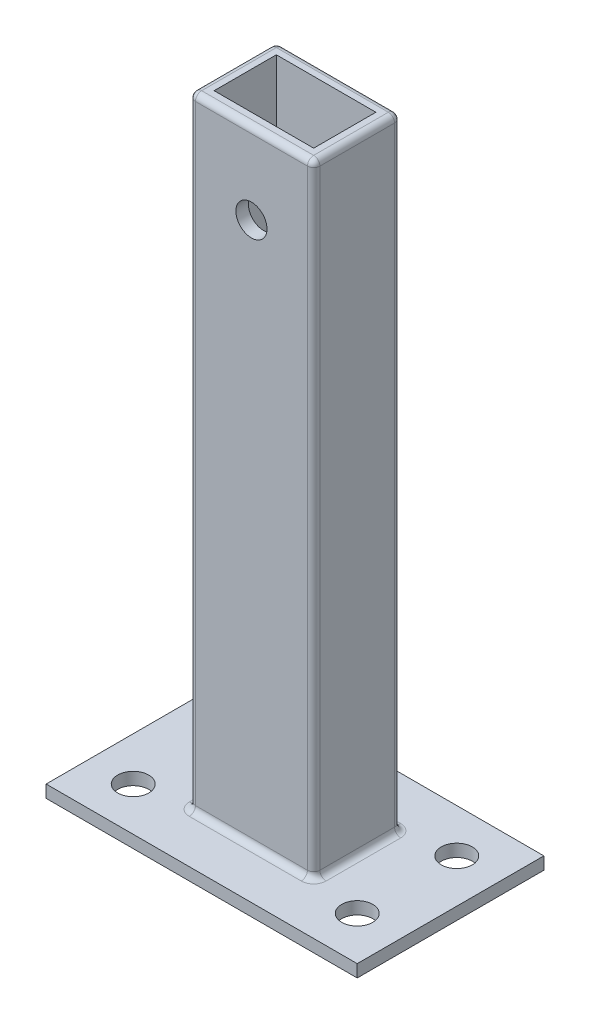
ISO-10303-21;
HEADER;
FILE_DESCRIPTION(('STEP AP214'),'2;1');
FILE_NAME('part.step','',(''),(''),'','','');
FILE_SCHEMA(('AUTOMOTIVE_DESIGN { 1 0 10303 214 1 1 1 1 }'));
ENDSEC;
DATA;
#1=APPLICATION_CONTEXT('core data for automotive mechanical design processes');
#2=APPLICATION_PROTOCOL_DEFINITION('international standard','automotive_design',2000,#1);
#3=PRODUCT_CONTEXT('',#1,'mechanical');
#4=PRODUCT('Part','Part','',(#3));
#5=PRODUCT_RELATED_PRODUCT_CATEGORY('part','',(#4));
#6=PRODUCT_DEFINITION_FORMATION('','',#4);
#7=PRODUCT_DEFINITION_CONTEXT('part definition',#1,'design');
#8=PRODUCT_DEFINITION('design','',#6,#7);
#9=PRODUCT_DEFINITION_SHAPE('','',#8);
#10=(LENGTH_UNIT() NAMED_UNIT(*) SI_UNIT(.MILLI.,.METRE.));
#11=(NAMED_UNIT(*) PLANE_ANGLE_UNIT() SI_UNIT($,.RADIAN.));
#12=(NAMED_UNIT(*) SI_UNIT($,.STERADIAN.) SOLID_ANGLE_UNIT());
#13=UNCERTAINTY_MEASURE_WITH_UNIT(LENGTH_MEASURE(1.E-05),#10,'distance_accuracy_value','');
#14=(GEOMETRIC_REPRESENTATION_CONTEXT(3) GLOBAL_UNCERTAINTY_ASSIGNED_CONTEXT((#13)) GLOBAL_UNIT_ASSIGNED_CONTEXT((#10,
#11,#12)) REPRESENTATION_CONTEXT('',''));
#15=CARTESIAN_POINT('',(0.,0.,0.));
#16=DIRECTION('',(0.,0.,1.));
#17=DIRECTION('',(1.,0.,0.));
#18=AXIS2_PLACEMENT_3D('',#15,#16,#17);
#19=CARTESIAN_POINT('',(0.,0.,0.));
#20=DIRECTION('',(0.,-1.,0.));
#21=DIRECTION('',(0.,0.,-1.));
#22=AXIS2_PLACEMENT_3D('',#19,#20,#21);
#23=PLANE('',#22);
#24=DIRECTION('',(0.,0.,1.));
#25=VECTOR('',#24,1.);
#26=CARTESIAN_POINT('',(25.,0.,15.));
#27=LINE('',#26,#25);
#28=CARTESIAN_POINT('',(25.,0.,-15.));
#29=VERTEX_POINT('',#28);
#30=CARTESIAN_POINT('',(25.,0.,15.));
#31=VERTEX_POINT('',#30);
#32=EDGE_CURVE('E220',#29,#31,#27,.T.);
#33=ORIENTED_EDGE('',*,*,#32,.F.);
#34=DIRECTION('',(1.,0.,0.));
#35=VECTOR('',#34,1.);
#36=CARTESIAN_POINT('',(-25.,0.,-15.));
#37=LINE('',#36,#35);
#38=CARTESIAN_POINT('',(-25.,0.,-15.));
#39=VERTEX_POINT('',#38);
#40=EDGE_CURVE('E216',#39,#29,#37,.T.);
#41=ORIENTED_EDGE('',*,*,#40,.F.);
#42=DIRECTION('',(0.,0.,-1.));
#43=VECTOR('',#42,1.);
#44=CARTESIAN_POINT('',(-25.,0.,15.));
#45=LINE('',#44,#43);
#46=CARTESIAN_POINT('',(-25.,0.,15.));
#47=VERTEX_POINT('',#46);
#48=EDGE_CURVE('E510',#47,#39,#45,.T.);
#49=ORIENTED_EDGE('',*,*,#48,.F.);
#50=DIRECTION('',(-1.,0.,0.));
#51=VECTOR('',#50,1.);
#52=CARTESIAN_POINT('',(-25.,0.,15.));
#53=LINE('',#52,#51);
#54=EDGE_CURVE('E507',#31,#47,#53,.T.);
#55=ORIENTED_EDGE('',*,*,#54,.F.);
#56=EDGE_LOOP('',(#33,#41,#49,#55));
#57=FACE_BOUND('',#56,.T.);
#58=CARTESIAN_POINT('',(18.,0.,8.00000000000001));
#59=DIRECTION('',(0.,1.,0.));
#60=DIRECTION('',(0.,0.,1.));
#61=AXIS2_PLACEMENT_3D('',#58,#59,#60);
#62=CIRCLE('',#61,2.5);
#63=CARTESIAN_POINT('',(18.,0.,10.5));
#64=VERTEX_POINT('',#63);
#65=EDGE_CURVE('E481',#64,#64,#62,.T.);
#66=ORIENTED_EDGE('',*,*,#65,.F.);
#67=EDGE_LOOP('',(#66));
#68=FACE_BOUND('',#67,.T.);
#69=CARTESIAN_POINT('',(-18.,0.,-8.00000000000001));
#70=DIRECTION('',(0.,1.,0.));
#71=DIRECTION('',(0.,0.,1.));
#72=AXIS2_PLACEMENT_3D('',#69,#70,#71);
#73=CIRCLE('',#72,2.5);
#74=CARTESIAN_POINT('',(-18.,0.,-5.50000000000001));
#75=VERTEX_POINT('',#74);
#76=EDGE_CURVE('E468',#75,#75,#73,.T.);
#77=ORIENTED_EDGE('',*,*,#76,.F.);
#78=EDGE_LOOP('',(#77));
#79=FACE_BOUND('',#78,.T.);
#80=CARTESIAN_POINT('',(-18.,0.,8.00000000000001));
#81=DIRECTION('',(0.,1.,0.));
#82=DIRECTION('',(0.,0.,-1.));
#83=AXIS2_PLACEMENT_3D('',#80,#81,#82);
#84=CIRCLE('',#83,2.5);
#85=CARTESIAN_POINT('',(-18.,0.,5.50000000000001));
#86=VERTEX_POINT('',#85);
#87=EDGE_CURVE('E473',#86,#86,#84,.T.);
#88=ORIENTED_EDGE('',*,*,#87,.F.);
#89=EDGE_LOOP('',(#88));
#90=FACE_BOUND('',#89,.T.);
#91=CARTESIAN_POINT('',(18.,0.,-8.00000000000001));
#92=DIRECTION('',(0.,1.,0.));
#93=DIRECTION('',(0.,0.,-1.));
#94=AXIS2_PLACEMENT_3D('',#91,#92,#93);
#95=CIRCLE('',#94,2.5);
#96=CARTESIAN_POINT('',(18.,0.,-10.5));
#97=VERTEX_POINT('',#96);
#98=EDGE_CURVE('E482',#97,#97,#95,.T.);
#99=ORIENTED_EDGE('',*,*,#98,.F.);
#100=EDGE_LOOP('',(#99));
#101=FACE_BOUND('',#100,.T.);
#102=CARTESIAN_POINT('',(9.,0.,6.));
#103=DIRECTION('',(0.,-1.,0.));
#104=DIRECTION('',(0.,0.,-1.));
#105=AXIS2_PLACEMENT_3D('',#102,#103,#104);
#106=CIRCLE('',#105,2.);
#107=CARTESIAN_POINT('',(9.,0.,8.));
#108=VERTEX_POINT('',#107);
#109=CARTESIAN_POINT('',(11.,0.,6.));
#110=VERTEX_POINT('',#109);
#111=EDGE_CURVE('E314',#108,#110,#106,.F.);
#112=ORIENTED_EDGE('',*,*,#111,.F.);
#113=DIRECTION('',(1.,0.,0.));
#114=VECTOR('',#113,1.);
#115=CARTESIAN_POINT('',(-10.,0.,8.));
#116=LINE('',#115,#114);
#117=CARTESIAN_POINT('',(-9.,0.,8.));
#118=VERTEX_POINT('',#117);
#119=EDGE_CURVE('E310',#108,#118,#116,.F.);
#120=ORIENTED_EDGE('',*,*,#119,.T.);
#121=CARTESIAN_POINT('',(-9.,0.,6.));
#122=DIRECTION('',(0.,-1.,0.));
#123=DIRECTION('',(0.,0.,-1.));
#124=AXIS2_PLACEMENT_3D('',#121,#122,#123);
#125=CIRCLE('',#124,2.);
#126=CARTESIAN_POINT('',(-11.,0.,6.));
#127=VERTEX_POINT('',#126);
#128=EDGE_CURVE('E306',#127,#118,#125,.F.);
#129=ORIENTED_EDGE('',*,*,#128,.F.);
#130=DIRECTION('',(0.,0.,1.));
#131=VECTOR('',#130,1.);
#132=CARTESIAN_POINT('',(-11.,0.,-7.));
#133=LINE('',#132,#131);
#134=CARTESIAN_POINT('',(-11.,0.,-6.));
#135=VERTEX_POINT('',#134);
#136=EDGE_CURVE('E300',#127,#135,#133,.F.);
#137=ORIENTED_EDGE('',*,*,#136,.T.);
#138=CARTESIAN_POINT('',(-9.,0.,-6.));
#139=DIRECTION('',(0.,-1.,0.));
#140=DIRECTION('',(0.,0.,-1.));
#141=AXIS2_PLACEMENT_3D('',#138,#139,#140);
#142=CIRCLE('',#141,2.);
#143=CARTESIAN_POINT('',(-9.,0.,-8.));
#144=VERTEX_POINT('',#143);
#145=EDGE_CURVE('E296',#144,#135,#142,.F.);
#146=ORIENTED_EDGE('',*,*,#145,.F.);
#147=DIRECTION('',(-1.,0.,0.));
#148=VECTOR('',#147,1.);
#149=CARTESIAN_POINT('',(10.,0.,-8.));
#150=LINE('',#149,#148);
#151=CARTESIAN_POINT('',(9.,0.,-8.));
#152=VERTEX_POINT('',#151);
#153=EDGE_CURVE('E293',#144,#152,#150,.F.);
#154=ORIENTED_EDGE('',*,*,#153,.T.);
#155=CARTESIAN_POINT('',(9.,0.,-6.));
#156=DIRECTION('',(0.,-1.,0.));
#157=DIRECTION('',(0.,0.,-1.));
#158=AXIS2_PLACEMENT_3D('',#155,#156,#157);
#159=CIRCLE('',#158,2.);
#160=CARTESIAN_POINT('',(11.,0.,-6.));
#161=VERTEX_POINT('',#160);
#162=EDGE_CURVE('E289',#161,#152,#159,.F.);
#163=ORIENTED_EDGE('',*,*,#162,.F.);
#164=DIRECTION('',(0.,0.,-1.));
#165=VECTOR('',#164,1.);
#166=CARTESIAN_POINT('',(11.,0.,7.));
#167=LINE('',#166,#165);
#168=EDGE_CURVE('E303',#161,#110,#167,.F.);
#169=ORIENTED_EDGE('',*,*,#168,.T.);
#170=EDGE_LOOP('',(#112,#120,#129,#137,#146,#154,#163,#169));
#171=FACE_BOUND('',#170,.T.);
#172=ADVANCED_FACE('F41',(#57,#68,#79,#90,#101,#171),#23,.F.);
#173=CARTESIAN_POINT('',(0.,100.,0.));
#174=DIRECTION('',(0.,1.,0.));
#175=DIRECTION('',(0.,0.,1.));
#176=AXIS2_PLACEMENT_3D('',#173,#174,#175);
#177=PLANE('',#176);
#178=DIRECTION('',(1.,0.,0.));
#179=VECTOR('',#178,1.);
#180=CARTESIAN_POINT('',(10.,100.,6.));
#181=LINE('',#180,#179);
#182=CARTESIAN_POINT('',(-9.,100.,6.));
#183=VERTEX_POINT('',#182);
#184=CARTESIAN_POINT('',(9.,100.,6.));
#185=VERTEX_POINT('',#184);
#186=EDGE_CURVE('E357',#183,#185,#181,.T.);
#187=ORIENTED_EDGE('',*,*,#186,.T.);
#188=DIRECTION('',(0.,0.,-1.));
#189=VECTOR('',#188,1.);
#190=CARTESIAN_POINT('',(9.,100.,-7.));
#191=LINE('',#190,#189);
#192=CARTESIAN_POINT('',(9.,100.,-6.));
#193=VERTEX_POINT('',#192);
#194=EDGE_CURVE('E11',#185,#193,#191,.T.);
#195=ORIENTED_EDGE('',*,*,#194,.T.);
#196=DIRECTION('',(-1.,0.,0.));
#197=VECTOR('',#196,1.);
#198=CARTESIAN_POINT('',(-10.,100.,-6.));
#199=LINE('',#198,#197);
#200=CARTESIAN_POINT('',(-9.,100.,-6.));
#201=VERTEX_POINT('',#200);
#202=EDGE_CURVE('E51',#193,#201,#199,.T.);
#203=ORIENTED_EDGE('',*,*,#202,.T.);
#204=DIRECTION('',(0.,0.,1.));
#205=VECTOR('',#204,1.);
#206=CARTESIAN_POINT('',(-9.,100.,7.));
#207=LINE('',#206,#205);
#208=EDGE_CURVE('E360',#201,#183,#207,.T.);
#209=ORIENTED_EDGE('',*,*,#208,.T.);
#210=EDGE_LOOP('',(#187,#195,#203,#209));
#211=FACE_BOUND('',#210,.T.);
#212=DIRECTION('',(-1.,0.,0.));
#213=VECTOR('',#212,1.);
#214=CARTESIAN_POINT('',(-8.,100.,-5.));
#215=LINE('',#214,#213);
#216=CARTESIAN_POINT('',(8.,100.,-5.));
#217=VERTEX_POINT('',#216);
#218=CARTESIAN_POINT('',(-8.,100.,-5.));
#219=VERTEX_POINT('',#218);
#220=EDGE_CURVE('E236',#217,#219,#215,.T.);
#221=ORIENTED_EDGE('',*,*,#220,.F.);
#222=DIRECTION('',(0.,0.,-1.));
#223=VECTOR('',#222,1.);
#224=CARTESIAN_POINT('',(8.,100.,-5.));
#225=LINE('',#224,#223);
#226=CARTESIAN_POINT('',(8.,100.,5.));
#227=VERTEX_POINT('',#226);
#228=EDGE_CURVE('E233',#227,#217,#225,.T.);
#229=ORIENTED_EDGE('',*,*,#228,.F.);
#230=DIRECTION('',(1.,0.,0.));
#231=VECTOR('',#230,1.);
#232=CARTESIAN_POINT('',(-8.,100.,5.));
#233=LINE('',#232,#231);
#234=CARTESIAN_POINT('',(-8.,100.,5.));
#235=VERTEX_POINT('',#234);
#236=EDGE_CURVE('E244',#235,#227,#233,.T.);
#237=ORIENTED_EDGE('',*,*,#236,.F.);
#238=DIRECTION('',(0.,0.,1.));
#239=VECTOR('',#238,1.);
#240=CARTESIAN_POINT('',(-8.,100.,-5.));
#241=LINE('',#240,#239);
#242=EDGE_CURVE('E240',#219,#235,#241,.T.);
#243=ORIENTED_EDGE('',*,*,#242,.F.);
#244=EDGE_LOOP('',(#221,#229,#237,#243));
#245=FACE_BOUND('',#244,.T.);
#246=ADVANCED_FACE('F536',(#211,#245),#177,.T.);
#247=CARTESIAN_POINT('',(10.,100.,-7.));
#248=DIRECTION('',(-1.,0.,0.));
#249=DIRECTION('',(0.,0.,1.));
#250=AXIS2_PLACEMENT_3D('',#247,#248,#249);
#251=PLANE('',#250);
#252=DIRECTION('',(0.,-1.,0.));
#253=VECTOR('',#252,1.);
#254=CARTESIAN_POINT('',(10.,100.,6.));
#255=LINE('',#254,#253);
#256=CARTESIAN_POINT('',(10.,99.,6.));
#257=VERTEX_POINT('',#256);
#258=CARTESIAN_POINT('',(10.,1.,6.));
#259=VERTEX_POINT('',#258);
#260=EDGE_CURVE('E321',#257,#259,#255,.T.);
#261=ORIENTED_EDGE('',*,*,#260,.T.);
#262=DIRECTION('',(0.,0.,-1.));
#263=VECTOR('',#262,1.);
#264=CARTESIAN_POINT('',(10.,1.,-7.));
#265=LINE('',#264,#263);
#266=CARTESIAN_POINT('',(10.,1.,-6.));
#267=VERTEX_POINT('',#266);
#268=EDGE_CURVE('E327',#259,#267,#265,.T.);
#269=ORIENTED_EDGE('',*,*,#268,.T.);
#270=DIRECTION('',(0.,-1.,0.));
#271=VECTOR('',#270,1.);
#272=CARTESIAN_POINT('',(10.,100.,-6.));
#273=LINE('',#272,#271);
#274=CARTESIAN_POINT('',(10.,99.,-6.));
#275=VERTEX_POINT('',#274);
#276=EDGE_CURVE('E324',#267,#275,#273,.F.);
#277=ORIENTED_EDGE('',*,*,#276,.T.);
#278=DIRECTION('',(0.,0.,-1.));
#279=VECTOR('',#278,1.);
#280=CARTESIAN_POINT('',(10.,99.,7.));
#281=LINE('',#280,#279);
#282=EDGE_CURVE('E318',#275,#257,#281,.F.);
#283=ORIENTED_EDGE('',*,*,#282,.T.);
#284=EDGE_LOOP('',(#261,#269,#277,#283));
#285=FACE_BOUND('',#284,.T.);
#286=ADVANCED_FACE('F542',(#285),#251,.F.);
#287=CARTESIAN_POINT('',(-10.,100.,-7.));
#288=DIRECTION('',(0.,0.,1.));
#289=DIRECTION('',(1.,0.,0.));
#290=AXIS2_PLACEMENT_3D('',#287,#288,#289);
#291=PLANE('',#290);
#292=DIRECTION('',(0.,-1.,0.));
#293=VECTOR('',#292,1.);
#294=CARTESIAN_POINT('',(9.,100.,-7.));
#295=LINE('',#294,#293);
#296=CARTESIAN_POINT('',(9.,99.,-7.));
#297=VERTEX_POINT('',#296);
#298=CARTESIAN_POINT('',(9.,1.,-7.));
#299=VERTEX_POINT('',#298);
#300=EDGE_CURVE('E350',#297,#299,#295,.T.);
#301=ORIENTED_EDGE('',*,*,#300,.T.);
#302=DIRECTION('',(-1.,0.,0.));
#303=VECTOR('',#302,1.);
#304=CARTESIAN_POINT('',(-10.,1.,-7.));
#305=LINE('',#304,#303);
#306=CARTESIAN_POINT('',(-9.,1.,-7.));
#307=VERTEX_POINT('',#306);
#308=EDGE_CURVE('E353',#299,#307,#305,.T.);
#309=ORIENTED_EDGE('',*,*,#308,.T.);
#310=DIRECTION('',(0.,-1.,0.));
#311=VECTOR('',#310,1.);
#312=CARTESIAN_POINT('',(-9.,100.,-7.));
#313=LINE('',#312,#311);
#314=CARTESIAN_POINT('',(-9.,99.,-7.));
#315=VERTEX_POINT('',#314);
#316=EDGE_CURVE('E347',#307,#315,#313,.F.);
#317=ORIENTED_EDGE('',*,*,#316,.T.);
#318=DIRECTION('',(-1.,0.,0.));
#319=VECTOR('',#318,1.);
#320=CARTESIAN_POINT('',(10.,99.,-7.));
#321=LINE('',#320,#319);
#322=EDGE_CURVE('E344',#315,#297,#321,.F.);
#323=ORIENTED_EDGE('',*,*,#322,.T.);
#324=EDGE_LOOP('',(#301,#309,#317,#323));
#325=FACE_BOUND('',#324,.T.);
#326=CARTESIAN_POINT('',(0.,87.,-7.));
#327=DIRECTION('',(0.,0.,1.));
#328=DIRECTION('',(1.,0.,0.));
#329=AXIS2_PLACEMENT_3D('',#326,#327,#328);
#330=CIRCLE('',#329,2.5);
#331=CARTESIAN_POINT('',(2.5,87.,-7.));
#332=VERTEX_POINT('',#331);
#333=EDGE_CURVE('E464',#332,#332,#330,.T.);
#334=ORIENTED_EDGE('',*,*,#333,.T.);
#335=EDGE_LOOP('',(#334));
#336=FACE_BOUND('',#335,.T.);
#337=ADVANCED_FACE('F590',(#325,#336),#291,.F.);
#338=CARTESIAN_POINT('',(-10.,100.,-7.));
#339=DIRECTION('',(1.,0.,0.));
#340=DIRECTION('',(0.,0.,-1.));
#341=AXIS2_PLACEMENT_3D('',#338,#339,#340);
#342=PLANE('',#341);
#343=DIRECTION('',(0.,-1.,0.));
#344=VECTOR('',#343,1.);
#345=CARTESIAN_POINT('',(-10.,100.,-6.));
#346=LINE('',#345,#344);
#347=CARTESIAN_POINT('',(-10.,99.,-6.));
#348=VERTEX_POINT('',#347);
#349=CARTESIAN_POINT('',(-10.,1.,-6.));
#350=VERTEX_POINT('',#349);
#351=EDGE_CURVE('E337',#348,#350,#346,.T.);
#352=ORIENTED_EDGE('',*,*,#351,.T.);
#353=DIRECTION('',(0.,0.,1.));
#354=VECTOR('',#353,1.);
#355=CARTESIAN_POINT('',(-10.,1.,7.));
#356=LINE('',#355,#354);
#357=CARTESIAN_POINT('',(-10.,1.,6.));
#358=VERTEX_POINT('',#357);
#359=EDGE_CURVE('E340',#350,#358,#356,.T.);
#360=ORIENTED_EDGE('',*,*,#359,.T.);
#361=DIRECTION('',(0.,-1.,0.));
#362=VECTOR('',#361,1.);
#363=CARTESIAN_POINT('',(-10.,100.,6.));
#364=LINE('',#363,#362);
#365=CARTESIAN_POINT('',(-10.,99.,6.));
#366=VERTEX_POINT('',#365);
#367=EDGE_CURVE('E331',#358,#366,#364,.F.);
#368=ORIENTED_EDGE('',*,*,#367,.T.);
#369=DIRECTION('',(0.,0.,1.));
#370=VECTOR('',#369,1.);
#371=CARTESIAN_POINT('',(-10.,99.,-7.));
#372=LINE('',#371,#370);
#373=EDGE_CURVE('E334',#366,#348,#372,.F.);
#374=ORIENTED_EDGE('',*,*,#373,.T.);
#375=EDGE_LOOP('',(#352,#360,#368,#374));
#376=FACE_BOUND('',#375,.T.);
#377=ADVANCED_FACE('F586',(#376),#342,.F.);
#378=CARTESIAN_POINT('',(-10.,100.,7.));
#379=DIRECTION('',(0.,0.,-1.));
#380=DIRECTION('',(-1.,0.,0.));
#381=AXIS2_PLACEMENT_3D('',#378,#379,#380);
#382=PLANE('',#381);
#383=DIRECTION('',(0.,-1.,0.));
#384=VECTOR('',#383,1.);
#385=CARTESIAN_POINT('',(-9.,100.,7.));
#386=LINE('',#385,#384);
#387=CARTESIAN_POINT('',(-9.,99.,7.));
#388=VERTEX_POINT('',#387);
#389=CARTESIAN_POINT('',(-9.,1.,7.));
#390=VERTEX_POINT('',#389);
#391=EDGE_CURVE('E279',#388,#390,#386,.T.);
#392=ORIENTED_EDGE('',*,*,#391,.T.);
#393=DIRECTION('',(1.,0.,0.));
#394=VECTOR('',#393,1.);
#395=CARTESIAN_POINT('',(10.,1.,7.));
#396=LINE('',#395,#394);
#397=CARTESIAN_POINT('',(9.,1.,7.));
#398=VERTEX_POINT('',#397);
#399=EDGE_CURVE('E285',#390,#398,#396,.T.);
#400=ORIENTED_EDGE('',*,*,#399,.T.);
#401=DIRECTION('',(0.,-1.,0.));
#402=VECTOR('',#401,1.);
#403=CARTESIAN_POINT('',(9.,100.,7.));
#404=LINE('',#403,#402);
#405=CARTESIAN_POINT('',(9.,99.,7.));
#406=VERTEX_POINT('',#405);
#407=EDGE_CURVE('E282',#398,#406,#404,.F.);
#408=ORIENTED_EDGE('',*,*,#407,.T.);
#409=DIRECTION('',(1.,0.,0.));
#410=VECTOR('',#409,1.);
#411=CARTESIAN_POINT('',(-10.,99.,7.));
#412=LINE('',#411,#410);
#413=EDGE_CURVE('E270',#406,#388,#412,.F.);
#414=ORIENTED_EDGE('',*,*,#413,.T.);
#415=EDGE_LOOP('',(#392,#400,#408,#414));
#416=FACE_BOUND('',#415,.T.);
#417=CARTESIAN_POINT('',(0.,87.,7.));
#418=DIRECTION('',(0.,0.,1.));
#419=DIRECTION('',(1.,0.,0.));
#420=AXIS2_PLACEMENT_3D('',#417,#418,#419);
#421=CIRCLE('',#420,2.5);
#422=CARTESIAN_POINT('',(2.5,87.,7.));
#423=VERTEX_POINT('',#422);
#424=EDGE_CURVE('E276',#423,#423,#421,.T.);
#425=ORIENTED_EDGE('',*,*,#424,.F.);
#426=EDGE_LOOP('',(#425));
#427=FACE_BOUND('',#426,.T.);
#428=ADVANCED_FACE('F582',(#416,#427),#382,.F.);
#429=CARTESIAN_POINT('',(8.,100.,-5.));
#430=DIRECTION('',(-1.,0.,0.));
#431=DIRECTION('',(0.,0.,1.));
#432=AXIS2_PLACEMENT_3D('',#429,#430,#431);
#433=PLANE('',#432);
#434=DIRECTION('',(0.,0.,-1.));
#435=VECTOR('',#434,1.);
#436=CARTESIAN_POINT('',(8.,0.,-5.));
#437=LINE('',#436,#435);
#438=CARTESIAN_POINT('',(8.,0.,5.));
#439=VERTEX_POINT('',#438);
#440=CARTESIAN_POINT('',(8.,0.,-5.));
#441=VERTEX_POINT('',#440);
#442=EDGE_CURVE('E222',#439,#441,#437,.T.);
#443=ORIENTED_EDGE('',*,*,#442,.F.);
#444=DIRECTION('',(0.,-1.,0.));
#445=VECTOR('',#444,1.);
#446=CARTESIAN_POINT('',(8.,100.,5.));
#447=LINE('',#446,#445);
#448=EDGE_CURVE('E246',#227,#439,#447,.T.);
#449=ORIENTED_EDGE('',*,*,#448,.F.);
#450=ORIENTED_EDGE('',*,*,#228,.T.);
#451=DIRECTION('',(0.,-1.,0.));
#452=VECTOR('',#451,1.);
#453=CARTESIAN_POINT('',(8.,100.,-5.));
#454=LINE('',#453,#452);
#455=EDGE_CURVE('E266',#217,#441,#454,.T.);
#456=ORIENTED_EDGE('',*,*,#455,.T.);
#457=EDGE_LOOP('',(#443,#449,#450,#456));
#458=FACE_BOUND('',#457,.T.);
#459=ADVANCED_FACE('F564',(#458),#433,.T.);
#460=CARTESIAN_POINT('',(-8.,100.,-5.));
#461=DIRECTION('',(0.,0.,1.));
#462=DIRECTION('',(1.,0.,0.));
#463=AXIS2_PLACEMENT_3D('',#460,#461,#462);
#464=PLANE('',#463);
#465=CARTESIAN_POINT('',(0.,87.,-5.));
#466=DIRECTION('',(0.,0.,1.));
#467=DIRECTION('',(1.,0.,0.));
#468=AXIS2_PLACEMENT_3D('',#465,#466,#467);
#469=CIRCLE('',#468,2.5);
#470=CARTESIAN_POINT('',(2.5,87.,-5.));
#471=VERTEX_POINT('',#470);
#472=EDGE_CURVE('E275',#471,#471,#469,.T.);
#473=ORIENTED_EDGE('',*,*,#472,.F.);
#474=EDGE_LOOP('',(#473));
#475=FACE_BOUND('',#474,.T.);
#476=DIRECTION('',(-1.,0.,0.));
#477=VECTOR('',#476,1.);
#478=CARTESIAN_POINT('',(-8.,0.,-5.));
#479=LINE('',#478,#477);
#480=CARTESIAN_POINT('',(-8.,0.,-5.));
#481=VERTEX_POINT('',#480);
#482=EDGE_CURVE('E227',#441,#481,#479,.T.);
#483=ORIENTED_EDGE('',*,*,#482,.F.);
#484=ORIENTED_EDGE('',*,*,#455,.F.);
#485=ORIENTED_EDGE('',*,*,#220,.T.);
#486=DIRECTION('',(0.,-1.,0.));
#487=VECTOR('',#486,1.);
#488=CARTESIAN_POINT('',(-8.,100.,-5.));
#489=LINE('',#488,#487);
#490=EDGE_CURVE('E263',#219,#481,#489,.T.);
#491=ORIENTED_EDGE('',*,*,#490,.T.);
#492=EDGE_LOOP('',(#483,#484,#485,#491));
#493=FACE_BOUND('',#492,.T.);
#494=ADVANCED_FACE('F568',(#475,#493),#464,.T.);
#495=CARTESIAN_POINT('',(-8.,100.,-5.));
#496=DIRECTION('',(1.,0.,0.));
#497=DIRECTION('',(0.,0.,-1.));
#498=AXIS2_PLACEMENT_3D('',#495,#496,#497);
#499=PLANE('',#498);
#500=DIRECTION('',(0.,0.,1.));
#501=VECTOR('',#500,1.);
#502=CARTESIAN_POINT('',(-8.,0.,-5.));
#503=LINE('',#502,#501);
#504=CARTESIAN_POINT('',(-8.,0.,5.));
#505=VERTEX_POINT('',#504);
#506=EDGE_CURVE('E251',#481,#505,#503,.T.);
#507=ORIENTED_EDGE('',*,*,#506,.F.);
#508=ORIENTED_EDGE('',*,*,#490,.F.);
#509=ORIENTED_EDGE('',*,*,#242,.T.);
#510=DIRECTION('',(0.,-1.,0.));
#511=VECTOR('',#510,1.);
#512=CARTESIAN_POINT('',(-8.,100.,5.));
#513=LINE('',#512,#511);
#514=EDGE_CURVE('E260',#235,#505,#513,.T.);
#515=ORIENTED_EDGE('',*,*,#514,.T.);
#516=EDGE_LOOP('',(#507,#508,#509,#515));
#517=FACE_BOUND('',#516,.T.);
#518=ADVANCED_FACE('F553',(#517),#499,.T.);
#519=CARTESIAN_POINT('',(-8.,100.,5.));
#520=DIRECTION('',(0.,0.,-1.));
#521=DIRECTION('',(-1.,0.,0.));
#522=AXIS2_PLACEMENT_3D('',#519,#520,#521);
#523=PLANE('',#522);
#524=CARTESIAN_POINT('',(0.,87.,5.));
#525=DIRECTION('',(0.,0.,-1.));
#526=DIRECTION('',(-1.,0.,0.));
#527=AXIS2_PLACEMENT_3D('',#524,#525,#526);
#528=CIRCLE('',#527,2.5);
#529=CARTESIAN_POINT('',(-2.5,87.,5.));
#530=VERTEX_POINT('',#529);
#531=EDGE_CURVE('E271',#530,#530,#528,.T.);
#532=ORIENTED_EDGE('',*,*,#531,.F.);
#533=EDGE_LOOP('',(#532));
#534=FACE_BOUND('',#533,.T.);
#535=DIRECTION('',(1.,0.,0.));
#536=VECTOR('',#535,1.);
#537=CARTESIAN_POINT('',(-8.,0.,5.));
#538=LINE('',#537,#536);
#539=EDGE_CURVE('E237',#505,#439,#538,.T.);
#540=ORIENTED_EDGE('',*,*,#539,.F.);
#541=ORIENTED_EDGE('',*,*,#514,.F.);
#542=ORIENTED_EDGE('',*,*,#236,.T.);
#543=ORIENTED_EDGE('',*,*,#448,.T.);
#544=EDGE_LOOP('',(#540,#541,#542,#543));
#545=FACE_BOUND('',#544,.T.);
#546=ADVANCED_FACE('F546',(#534,#545),#523,.T.);
#547=ORIENTED_EDGE('',*,*,#539,.T.);
#548=ORIENTED_EDGE('',*,*,#442,.T.);
#549=ORIENTED_EDGE('',*,*,#482,.T.);
#550=ORIENTED_EDGE('',*,*,#506,.T.);
#551=EDGE_LOOP('',(#547,#548,#549,#550));
#552=FACE_BOUND('',#551,.T.);
#553=ADVANCED_FACE('F538',(#552),#23,.F.);
#554=CARTESIAN_POINT('',(25.,-2.,15.));
#555=DIRECTION('',(-1.,0.,0.));
#556=DIRECTION('',(0.,0.,1.));
#557=AXIS2_PLACEMENT_3D('',#554,#555,#556);
#558=PLANE('',#557);
#559=ORIENTED_EDGE('',*,*,#32,.T.);
#560=DIRECTION('',(0.,1.,0.));
#561=VECTOR('',#560,1.);
#562=CARTESIAN_POINT('',(25.,-2.,15.));
#563=LINE('',#562,#561);
#564=CARTESIAN_POINT('',(25.,-2.,15.));
#565=VERTEX_POINT('',#564);
#566=EDGE_CURVE('E198',#565,#31,#563,.T.);
#567=ORIENTED_EDGE('',*,*,#566,.F.);
#568=DIRECTION('',(0.,0.,1.));
#569=VECTOR('',#568,1.);
#570=CARTESIAN_POINT('',(25.,-2.,15.));
#571=LINE('',#570,#569);
#572=CARTESIAN_POINT('',(25.,-2.,-15.));
#573=VERTEX_POINT('',#572);
#574=EDGE_CURVE('E206',#573,#565,#571,.T.);
#575=ORIENTED_EDGE('',*,*,#574,.F.);
#576=DIRECTION('',(0.,1.,0.));
#577=VECTOR('',#576,1.);
#578=CARTESIAN_POINT('',(25.,-2.,-15.));
#579=LINE('',#578,#577);
#580=EDGE_CURVE('E504',#573,#29,#579,.T.);
#581=ORIENTED_EDGE('',*,*,#580,.T.);
#582=EDGE_LOOP('',(#559,#567,#575,#581));
#583=FACE_BOUND('',#582,.T.);
#584=ADVANCED_FACE('F218',(#583),#558,.F.);
#585=CARTESIAN_POINT('',(-25.,-2.,15.));
#586=DIRECTION('',(0.,0.,-1.));
#587=DIRECTION('',(-1.,0.,0.));
#588=AXIS2_PLACEMENT_3D('',#585,#586,#587);
#589=PLANE('',#588);
#590=ORIENTED_EDGE('',*,*,#54,.T.);
#591=DIRECTION('',(0.,1.,0.));
#592=VECTOR('',#591,1.);
#593=CARTESIAN_POINT('',(-25.,-2.,15.));
#594=LINE('',#593,#592);
#595=CARTESIAN_POINT('',(-25.,-2.,15.));
#596=VERTEX_POINT('',#595);
#597=EDGE_CURVE('E201',#596,#47,#594,.T.);
#598=ORIENTED_EDGE('',*,*,#597,.F.);
#599=DIRECTION('',(-1.,0.,0.));
#600=VECTOR('',#599,1.);
#601=CARTESIAN_POINT('',(-25.,-2.,15.));
#602=LINE('',#601,#600);
#603=EDGE_CURVE('E194',#565,#596,#602,.T.);
#604=ORIENTED_EDGE('',*,*,#603,.F.);
#605=ORIENTED_EDGE('',*,*,#566,.T.);
#606=EDGE_LOOP('',(#590,#598,#604,#605));
#607=FACE_BOUND('',#606,.T.);
#608=ADVANCED_FACE('F196',(#607),#589,.F.);
#609=CARTESIAN_POINT('',(-25.,-2.,15.));
#610=DIRECTION('',(1.,0.,0.));
#611=DIRECTION('',(0.,0.,-1.));
#612=AXIS2_PLACEMENT_3D('',#609,#610,#611);
#613=PLANE('',#612);
#614=ORIENTED_EDGE('',*,*,#48,.T.);
#615=DIRECTION('',(0.,1.,0.));
#616=VECTOR('',#615,1.);
#617=CARTESIAN_POINT('',(-25.,-2.,-15.));
#618=LINE('',#617,#616);
#619=CARTESIAN_POINT('',(-25.,-2.,-15.));
#620=VERTEX_POINT('',#619);
#621=EDGE_CURVE('E229',#620,#39,#618,.T.);
#622=ORIENTED_EDGE('',*,*,#621,.F.);
#623=DIRECTION('',(0.,0.,-1.));
#624=VECTOR('',#623,1.);
#625=CARTESIAN_POINT('',(-25.,-2.,15.));
#626=LINE('',#625,#624);
#627=EDGE_CURVE('E205',#596,#620,#626,.T.);
#628=ORIENTED_EDGE('',*,*,#627,.F.);
#629=ORIENTED_EDGE('',*,*,#597,.T.);
#630=EDGE_LOOP('',(#614,#622,#628,#629));
#631=FACE_BOUND('',#630,.T.);
#632=ADVANCED_FACE('F526',(#631),#613,.F.);
#633=CARTESIAN_POINT('',(-25.,-2.,-15.));
#634=DIRECTION('',(0.,0.,1.));
#635=DIRECTION('',(1.,0.,0.));
#636=AXIS2_PLACEMENT_3D('',#633,#634,#635);
#637=PLANE('',#636);
#638=ORIENTED_EDGE('',*,*,#40,.T.);
#639=ORIENTED_EDGE('',*,*,#580,.F.);
#640=DIRECTION('',(1.,0.,0.));
#641=VECTOR('',#640,1.);
#642=CARTESIAN_POINT('',(-25.,-2.,-15.));
#643=LINE('',#642,#641);
#644=EDGE_CURVE('E211',#620,#573,#643,.T.);
#645=ORIENTED_EDGE('',*,*,#644,.F.);
#646=ORIENTED_EDGE('',*,*,#621,.T.);
#647=EDGE_LOOP('',(#638,#639,#645,#646));
#648=FACE_BOUND('',#647,.T.);
#649=ADVANCED_FACE('F521',(#648),#637,.F.);
#650=CARTESIAN_POINT('',(0.,-2.,0.));
#651=DIRECTION('',(0.,-1.,0.));
#652=DIRECTION('',(0.,0.,-1.));
#653=AXIS2_PLACEMENT_3D('',#650,#651,#652);
#654=PLANE('',#653);
#655=CARTESIAN_POINT('',(18.,-2.,-8.00000000000001));
#656=DIRECTION('',(0.,1.,0.));
#657=DIRECTION('',(0.,0.,-1.));
#658=AXIS2_PLACEMENT_3D('',#655,#656,#657);
#659=CIRCLE('',#658,2.5);
#660=CARTESIAN_POINT('',(18.,-2.,-10.5));
#661=VERTEX_POINT('',#660);
#662=EDGE_CURVE('E477',#661,#661,#659,.T.);
#663=ORIENTED_EDGE('',*,*,#662,.T.);
#664=EDGE_LOOP('',(#663));
#665=FACE_BOUND('',#664,.T.);
#666=CARTESIAN_POINT('',(-18.,-2.,8.00000000000001));
#667=DIRECTION('',(0.,1.,0.));
#668=DIRECTION('',(0.,0.,-1.));
#669=AXIS2_PLACEMENT_3D('',#666,#667,#668);
#670=CIRCLE('',#669,2.5);
#671=CARTESIAN_POINT('',(-18.,-2.,5.50000000000001));
#672=VERTEX_POINT('',#671);
#673=EDGE_CURVE('E486',#672,#672,#670,.T.);
#674=ORIENTED_EDGE('',*,*,#673,.T.);
#675=EDGE_LOOP('',(#674));
#676=FACE_BOUND('',#675,.T.);
#677=CARTESIAN_POINT('',(-18.,-2.,-8.00000000000001));
#678=DIRECTION('',(0.,1.,0.));
#679=DIRECTION('',(0.,0.,1.));
#680=AXIS2_PLACEMENT_3D('',#677,#678,#679);
#681=CIRCLE('',#680,2.5);
#682=CARTESIAN_POINT('',(-18.,-2.,-5.50000000000001));
#683=VERTEX_POINT('',#682);
#684=EDGE_CURVE('E469',#683,#683,#681,.T.);
#685=ORIENTED_EDGE('',*,*,#684,.T.);
#686=EDGE_LOOP('',(#685));
#687=FACE_BOUND('',#686,.T.);
#688=CARTESIAN_POINT('',(18.,-2.,8.00000000000001));
#689=DIRECTION('',(0.,1.,0.));
#690=DIRECTION('',(0.,0.,1.));
#691=AXIS2_PLACEMENT_3D('',#688,#689,#690);
#692=CIRCLE('',#691,2.5);
#693=CARTESIAN_POINT('',(18.,-2.,10.5));
#694=VERTEX_POINT('',#693);
#695=EDGE_CURVE('E493',#694,#694,#692,.T.);
#696=ORIENTED_EDGE('',*,*,#695,.T.);
#697=EDGE_LOOP('',(#696));
#698=FACE_BOUND('',#697,.T.);
#699=ORIENTED_EDGE('',*,*,#574,.T.);
#700=ORIENTED_EDGE('',*,*,#603,.T.);
#701=ORIENTED_EDGE('',*,*,#627,.T.);
#702=ORIENTED_EDGE('',*,*,#644,.T.);
#703=EDGE_LOOP('',(#699,#700,#701,#702));
#704=FACE_BOUND('',#703,.T.);
#705=ADVANCED_FACE('F209',(#665,#676,#687,#698,#704),#654,.T.);
#706=CARTESIAN_POINT('',(18.,-2.,8.00000000000001));
#707=DIRECTION('',(0.,1.,0.));
#708=DIRECTION('',(0.,0.,1.));
#709=AXIS2_PLACEMENT_3D('',#706,#707,#708);
#710=CYLINDRICAL_SURFACE('',#709,2.5);
#711=ORIENTED_EDGE('',*,*,#695,.F.);
#712=EDGE_LOOP('',(#711));
#713=FACE_BOUND('',#712,.T.);
#714=ORIENTED_EDGE('',*,*,#65,.T.);
#715=EDGE_LOOP('',(#714));
#716=FACE_BOUND('',#715,.T.);
#717=ADVANCED_FACE('F732',(#713,#716),#710,.F.);
#718=CARTESIAN_POINT('',(-18.,-2.,-8.00000000000001));
#719=DIRECTION('',(0.,1.,0.));
#720=DIRECTION('',(0.,0.,1.));
#721=AXIS2_PLACEMENT_3D('',#718,#719,#720);
#722=CYLINDRICAL_SURFACE('',#721,2.5);
#723=ORIENTED_EDGE('',*,*,#684,.F.);
#724=EDGE_LOOP('',(#723));
#725=FACE_BOUND('',#724,.T.);
#726=ORIENTED_EDGE('',*,*,#76,.T.);
#727=EDGE_LOOP('',(#726));
#728=FACE_BOUND('',#727,.T.);
#729=ADVANCED_FACE('F728',(#725,#728),#722,.F.);
#730=CARTESIAN_POINT('',(-18.,-2.,8.00000000000001));
#731=DIRECTION('',(0.,1.,0.));
#732=DIRECTION('',(0.,0.,1.));
#733=AXIS2_PLACEMENT_3D('',#730,#731,#732);
#734=CYLINDRICAL_SURFACE('',#733,2.5);
#735=ORIENTED_EDGE('',*,*,#673,.F.);
#736=EDGE_LOOP('',(#735));
#737=FACE_BOUND('',#736,.T.);
#738=ORIENTED_EDGE('',*,*,#87,.T.);
#739=EDGE_LOOP('',(#738));
#740=FACE_BOUND('',#739,.T.);
#741=ADVANCED_FACE('F731',(#737,#740),#734,.F.);
#742=CARTESIAN_POINT('',(18.,-2.,-8.00000000000001));
#743=DIRECTION('',(0.,1.,0.));
#744=DIRECTION('',(0.,0.,1.));
#745=AXIS2_PLACEMENT_3D('',#742,#743,#744);
#746=CYLINDRICAL_SURFACE('',#745,2.5);
#747=ORIENTED_EDGE('',*,*,#662,.F.);
#748=EDGE_LOOP('',(#747));
#749=FACE_BOUND('',#748,.T.);
#750=ORIENTED_EDGE('',*,*,#98,.T.);
#751=EDGE_LOOP('',(#750));
#752=FACE_BOUND('',#751,.T.);
#753=ADVANCED_FACE('F725',(#749,#752),#746,.F.);
#754=CARTESIAN_POINT('',(0.,87.,-15.));
#755=DIRECTION('',(0.,0.,1.));
#756=DIRECTION('',(1.,0.,0.));
#757=AXIS2_PLACEMENT_3D('',#754,#755,#756);
#758=CYLINDRICAL_SURFACE('',#757,2.5);
#759=ORIENTED_EDGE('',*,*,#531,.T.);
#760=EDGE_LOOP('',(#759));
#761=FACE_BOUND('',#760,.T.);
#762=ORIENTED_EDGE('',*,*,#424,.T.);
#763=EDGE_LOOP('',(#762));
#764=FACE_BOUND('',#763,.T.);
#765=ADVANCED_FACE('F719',(#761,#764),#758,.F.);
#766=ORIENTED_EDGE('',*,*,#472,.T.);
#767=EDGE_LOOP('',(#766));
#768=FACE_BOUND('',#767,.T.);
#769=ORIENTED_EDGE('',*,*,#333,.F.);
#770=EDGE_LOOP('',(#769));
#771=FACE_BOUND('',#770,.T.);
#772=ADVANCED_FACE('F672',(#768,#771),#758,.F.);
#773=CARTESIAN_POINT('',(0.,99.,-6.));
#774=DIRECTION('',(1.,0.,0.));
#775=DIRECTION('',(0.,0.,-1.));
#776=AXIS2_PLACEMENT_3D('',#773,#774,#775);
#777=CYLINDRICAL_SURFACE('',#776,1.);
#778=CARTESIAN_POINT('',(-9.,99.,-6.));
#779=DIRECTION('',(-1.,0.,0.));
#780=DIRECTION('',(0.,0.,1.));
#781=AXIS2_PLACEMENT_3D('',#778,#779,#780);
#782=CIRCLE('',#781,1.);
#783=EDGE_CURVE('E45',#201,#315,#782,.T.);
#784=ORIENTED_EDGE('',*,*,#783,.F.);
#785=ORIENTED_EDGE('',*,*,#202,.F.);
#786=CARTESIAN_POINT('',(9.,99.,-6.));
#787=DIRECTION('',(1.,0.,0.));
#788=DIRECTION('',(0.,0.,-1.));
#789=AXIS2_PLACEMENT_3D('',#786,#787,#788);
#790=CIRCLE('',#789,1.);
#791=EDGE_CURVE('E445',#297,#193,#790,.T.);
#792=ORIENTED_EDGE('',*,*,#791,.F.);
#793=ORIENTED_EDGE('',*,*,#322,.F.);
#794=EDGE_LOOP('',(#784,#785,#792,#793));
#795=FACE_BOUND('',#794,.T.);
#796=ADVANCED_FACE('F43',(#795),#777,.T.);
#797=CARTESIAN_POINT('',(-9.,99.,-6.));
#798=DIRECTION('',(0.,0.,-1.));
#799=DIRECTION('',(-1.,0.,0.));
#800=AXIS2_PLACEMENT_3D('',#797,#798,#799);
#801=SPHERICAL_SURFACE('',#800,1.);
#802=CARTESIAN_POINT('',(-9.,99.,-6.));
#803=DIRECTION('',(0.,0.,-1.));
#804=DIRECTION('',(-1.,0.,0.));
#805=AXIS2_PLACEMENT_3D('',#802,#803,#804);
#806=CIRCLE('',#805,1.);
#807=EDGE_CURVE('E438',#201,#348,#806,.F.);
#808=ORIENTED_EDGE('',*,*,#807,.F.);
#809=ORIENTED_EDGE('',*,*,#783,.T.);
#810=CARTESIAN_POINT('',(-9.,99.,-6.));
#811=DIRECTION('',(0.,1.,0.));
#812=DIRECTION('',(0.,0.,1.));
#813=AXIS2_PLACEMENT_3D('',#810,#811,#812);
#814=CIRCLE('',#813,1.);
#815=EDGE_CURVE('E442',#348,#315,#814,.F.);
#816=ORIENTED_EDGE('',*,*,#815,.F.);
#817=EDGE_LOOP('',(#808,#809,#816));
#818=FACE_BOUND('',#817,.T.);
#819=ADVANCED_FACE('F667',(#818),#801,.T.);
#820=CARTESIAN_POINT('',(9.,99.,-6.));
#821=DIRECTION('',(0.,1.,0.));
#822=DIRECTION('',(0.,0.,1.));
#823=AXIS2_PLACEMENT_3D('',#820,#821,#822);
#824=SPHERICAL_SURFACE('',#823,1.);
#825=CARTESIAN_POINT('',(9.,99.,-6.));
#826=DIRECTION('',(0.,1.,0.));
#827=DIRECTION('',(0.,0.,1.));
#828=AXIS2_PLACEMENT_3D('',#825,#826,#827);
#829=CIRCLE('',#828,1.);
#830=EDGE_CURVE('E432',#297,#275,#829,.F.);
#831=ORIENTED_EDGE('',*,*,#830,.F.);
#832=ORIENTED_EDGE('',*,*,#791,.T.);
#833=CARTESIAN_POINT('',(9.,99.,-6.));
#834=DIRECTION('',(0.,0.,-1.));
#835=DIRECTION('',(-1.,0.,0.));
#836=AXIS2_PLACEMENT_3D('',#833,#834,#835);
#837=CIRCLE('',#836,1.);
#838=EDGE_CURVE('E59',#275,#193,#837,.F.);
#839=ORIENTED_EDGE('',*,*,#838,.F.);
#840=EDGE_LOOP('',(#831,#832,#839));
#841=FACE_BOUND('',#840,.T.);
#842=ADVANCED_FACE('F664',(#841),#824,.T.);
#843=CARTESIAN_POINT('',(-9.,100.,-6.));
#844=DIRECTION('',(0.,-1.,0.));
#845=DIRECTION('',(0.,0.,-1.));
#846=AXIS2_PLACEMENT_3D('',#843,#844,#845);
#847=CYLINDRICAL_SURFACE('',#846,1.);
#848=ORIENTED_EDGE('',*,*,#815,.T.);
#849=ORIENTED_EDGE('',*,*,#316,.F.);
#850=CARTESIAN_POINT('',(-9.,1.,-6.));
#851=DIRECTION('',(0.,-1.,0.));
#852=DIRECTION('',(0.,0.,-1.));
#853=AXIS2_PLACEMENT_3D('',#850,#851,#852);
#854=CIRCLE('',#853,1.);
#855=EDGE_CURVE('E425',#350,#307,#854,.T.);
#856=ORIENTED_EDGE('',*,*,#855,.F.);
#857=ORIENTED_EDGE('',*,*,#351,.F.);
#858=EDGE_LOOP('',(#848,#849,#856,#857));
#859=FACE_BOUND('',#858,.T.);
#860=ADVANCED_FACE('F660',(#859),#847,.T.);
#861=CARTESIAN_POINT('',(-9.,99.,0.));
#862=DIRECTION('',(0.,0.,-1.));
#863=DIRECTION('',(-1.,0.,0.));
#864=AXIS2_PLACEMENT_3D('',#861,#862,#863);
#865=CYLINDRICAL_SURFACE('',#864,1.);
#866=ORIENTED_EDGE('',*,*,#807,.T.);
#867=ORIENTED_EDGE('',*,*,#373,.F.);
#868=CARTESIAN_POINT('',(-9.,99.,6.));
#869=DIRECTION('',(0.,0.,1.));
#870=DIRECTION('',(1.,0.,0.));
#871=AXIS2_PLACEMENT_3D('',#868,#869,#870);
#872=CIRCLE('',#871,1.);
#873=EDGE_CURVE('E421',#183,#366,#872,.T.);
#874=ORIENTED_EDGE('',*,*,#873,.F.);
#875=ORIENTED_EDGE('',*,*,#208,.F.);
#876=EDGE_LOOP('',(#866,#867,#874,#875));
#877=FACE_BOUND('',#876,.T.);
#878=ADVANCED_FACE('F656',(#877),#865,.T.);
#879=CARTESIAN_POINT('',(0.,99.,6.));
#880=DIRECTION('',(-1.,0.,0.));
#881=DIRECTION('',(0.,0.,1.));
#882=AXIS2_PLACEMENT_3D('',#879,#880,#881);
#883=CYLINDRICAL_SURFACE('',#882,1.);
#884=CARTESIAN_POINT('',(9.,99.,6.));
#885=DIRECTION('',(1.,0.,0.));
#886=DIRECTION('',(0.,0.,-1.));
#887=AXIS2_PLACEMENT_3D('',#884,#885,#886);
#888=CIRCLE('',#887,1.);
#889=EDGE_CURVE('E413',#185,#406,#888,.T.);
#890=ORIENTED_EDGE('',*,*,#889,.F.);
#891=ORIENTED_EDGE('',*,*,#186,.F.);
#892=CARTESIAN_POINT('',(-9.,99.,6.));
#893=DIRECTION('',(-1.,0.,0.));
#894=DIRECTION('',(0.,0.,1.));
#895=AXIS2_PLACEMENT_3D('',#892,#893,#894);
#896=CIRCLE('',#895,1.);
#897=EDGE_CURVE('E417',#388,#183,#896,.T.);
#898=ORIENTED_EDGE('',*,*,#897,.F.);
#899=ORIENTED_EDGE('',*,*,#413,.F.);
#900=EDGE_LOOP('',(#890,#891,#898,#899));
#901=FACE_BOUND('',#900,.T.);
#902=ADVANCED_FACE('F653',(#901),#883,.T.);
#903=CARTESIAN_POINT('',(9.,99.,0.));
#904=DIRECTION('',(0.,0.,1.));
#905=DIRECTION('',(1.,0.,0.));
#906=AXIS2_PLACEMENT_3D('',#903,#904,#905);
#907=CYLINDRICAL_SURFACE('',#906,1.);
#908=ORIENTED_EDGE('',*,*,#838,.T.);
#909=ORIENTED_EDGE('',*,*,#194,.F.);
#910=CARTESIAN_POINT('',(9.,99.,6.));
#911=DIRECTION('',(0.,0.,1.));
#912=DIRECTION('',(0.,-1.,0.));
#913=AXIS2_PLACEMENT_3D('',#910,#911,#912);
#914=CIRCLE('',#913,1.);
#915=EDGE_CURVE('E409',#257,#185,#914,.T.);
#916=ORIENTED_EDGE('',*,*,#915,.F.);
#917=ORIENTED_EDGE('',*,*,#282,.F.);
#918=EDGE_LOOP('',(#908,#909,#916,#917));
#919=FACE_BOUND('',#918,.T.);
#920=ADVANCED_FACE('F649',(#919),#907,.T.);
#921=CARTESIAN_POINT('',(9.,100.,-6.));
#922=DIRECTION('',(0.,-1.,0.));
#923=DIRECTION('',(0.,0.,-1.));
#924=AXIS2_PLACEMENT_3D('',#921,#922,#923);
#925=CYLINDRICAL_SURFACE('',#924,1.);
#926=ORIENTED_EDGE('',*,*,#830,.T.);
#927=ORIENTED_EDGE('',*,*,#276,.F.);
#928=CARTESIAN_POINT('',(9.,1.,-6.));
#929=DIRECTION('',(0.,-1.,0.));
#930=DIRECTION('',(0.,0.,-1.));
#931=AXIS2_PLACEMENT_3D('',#928,#929,#930);
#932=CIRCLE('',#931,1.);
#933=EDGE_CURVE('E405',#299,#267,#932,.T.);
#934=ORIENTED_EDGE('',*,*,#933,.F.);
#935=ORIENTED_EDGE('',*,*,#300,.F.);
#936=EDGE_LOOP('',(#926,#927,#934,#935));
#937=FACE_BOUND('',#936,.T.);
#938=ADVANCED_FACE('F645',(#937),#925,.T.);
#939=CARTESIAN_POINT('',(-10.,1.,-8.));
#940=DIRECTION('',(1.,0.,0.));
#941=DIRECTION('',(0.,0.,-1.));
#942=AXIS2_PLACEMENT_3D('',#939,#940,#941);
#943=CYLINDRICAL_SURFACE('',#942,1.);
#944=CARTESIAN_POINT('',(9.,1.,-8.));
#945=DIRECTION('',(-1.,0.,0.));
#946=DIRECTION('',(0.,0.,1.));
#947=AXIS2_PLACEMENT_3D('',#944,#945,#946);
#948=CIRCLE('',#947,1.);
#949=EDGE_CURVE('E401',#152,#299,#948,.T.);
#950=ORIENTED_EDGE('',*,*,#949,.F.);
#951=ORIENTED_EDGE('',*,*,#153,.F.);
#952=CARTESIAN_POINT('',(-9.,1.,-8.));
#953=DIRECTION('',(1.,0.,0.));
#954=DIRECTION('',(0.,0.,-1.));
#955=AXIS2_PLACEMENT_3D('',#952,#953,#954);
#956=CIRCLE('',#955,1.);
#957=EDGE_CURVE('E428',#307,#144,#956,.T.);
#958=ORIENTED_EDGE('',*,*,#957,.F.);
#959=ORIENTED_EDGE('',*,*,#308,.F.);
#960=EDGE_LOOP('',(#950,#951,#958,#959));
#961=FACE_BOUND('',#960,.T.);
#962=ADVANCED_FACE('F641',(#961),#943,.F.);
#963=CARTESIAN_POINT('',(-9.,1.,-6.));
#964=DIRECTION('',(0.,-1.,0.));
#965=DIRECTION('',(0.,0.,-1.));
#966=AXIS2_PLACEMENT_3D('',#963,#964,#965);
#967=TOROIDAL_SURFACE('',#966,2.,1.);
#968=ORIENTED_EDGE('',*,*,#957,.T.);
#969=ORIENTED_EDGE('',*,*,#145,.T.);
#970=CARTESIAN_POINT('',(-11.,1.,-6.));
#971=DIRECTION('',(0.,0.,1.));
#972=DIRECTION('',(1.,0.,0.));
#973=AXIS2_PLACEMENT_3D('',#970,#971,#972);
#974=CIRCLE('',#973,1.);
#975=EDGE_CURVE('E397',#350,#135,#974,.F.);
#976=ORIENTED_EDGE('',*,*,#975,.F.);
#977=ORIENTED_EDGE('',*,*,#855,.T.);
#978=EDGE_LOOP('',(#968,#969,#976,#977));
#979=FACE_BOUND('',#978,.T.);
#980=ADVANCED_FACE('F637',(#979),#967,.F.);
#981=CARTESIAN_POINT('',(-9.,99.,6.));
#982=DIRECTION('',(0.,1.,0.));
#983=DIRECTION('',(0.,0.,1.));
#984=AXIS2_PLACEMENT_3D('',#981,#982,#983);
#985=SPHERICAL_SURFACE('',#984,1.);
#986=ORIENTED_EDGE('',*,*,#897,.T.);
#987=ORIENTED_EDGE('',*,*,#873,.T.);
#988=CARTESIAN_POINT('',(-9.,99.,6.));
#989=DIRECTION('',(0.,1.,0.));
#990=DIRECTION('',(0.,0.,1.));
#991=AXIS2_PLACEMENT_3D('',#988,#989,#990);
#992=CIRCLE('',#991,1.);
#993=EDGE_CURVE('E393',#388,#366,#992,.F.);
#994=ORIENTED_EDGE('',*,*,#993,.F.);
#995=EDGE_LOOP('',(#986,#987,#994));
#996=FACE_BOUND('',#995,.T.);
#997=ADVANCED_FACE('F633',(#996),#985,.T.);
#998=CARTESIAN_POINT('',(9.,99.,6.));
#999=DIRECTION('',(0.,1.,0.));
#1000=DIRECTION('',(0.,0.,1.));
#1001=AXIS2_PLACEMENT_3D('',#998,#999,#1000);
#1002=SPHERICAL_SURFACE('',#1001,1.);
#1003=ORIENTED_EDGE('',*,*,#915,.T.);
#1004=ORIENTED_EDGE('',*,*,#889,.T.);
#1005=CARTESIAN_POINT('',(9.,99.,6.));
#1006=DIRECTION('',(0.,1.,0.));
#1007=DIRECTION('',(0.,0.,1.));
#1008=AXIS2_PLACEMENT_3D('',#1005,#1006,#1007);
#1009=CIRCLE('',#1008,1.);
#1010=EDGE_CURVE('E389',#257,#406,#1009,.F.);
#1011=ORIENTED_EDGE('',*,*,#1010,.F.);
#1012=EDGE_LOOP('',(#1003,#1004,#1011));
#1013=FACE_BOUND('',#1012,.T.);
#1014=ADVANCED_FACE('F629',(#1013),#1002,.T.);
#1015=CARTESIAN_POINT('',(9.,1.,-6.));
#1016=DIRECTION('',(0.,-1.,0.));
#1017=DIRECTION('',(0.,0.,-1.));
#1018=AXIS2_PLACEMENT_3D('',#1015,#1016,#1017);
#1019=TOROIDAL_SURFACE('',#1018,2.,1.);
#1020=ORIENTED_EDGE('',*,*,#949,.T.);
#1021=ORIENTED_EDGE('',*,*,#933,.T.);
#1022=CARTESIAN_POINT('',(11.,1.,-6.));
#1023=DIRECTION('',(0.,0.,1.));
#1024=DIRECTION('',(1.,0.,0.));
#1025=AXIS2_PLACEMENT_3D('',#1022,#1023,#1024);
#1026=CIRCLE('',#1025,1.);
#1027=EDGE_CURVE('E386',#161,#267,#1026,.F.);
#1028=ORIENTED_EDGE('',*,*,#1027,.F.);
#1029=ORIENTED_EDGE('',*,*,#162,.T.);
#1030=EDGE_LOOP('',(#1020,#1021,#1028,#1029));
#1031=FACE_BOUND('',#1030,.T.);
#1032=ADVANCED_FACE('F625',(#1031),#1019,.F.);
#1033=CARTESIAN_POINT('',(-11.,1.,-7.));
#1034=DIRECTION('',(0.,0.,-1.));
#1035=DIRECTION('',(-1.,0.,0.));
#1036=AXIS2_PLACEMENT_3D('',#1033,#1034,#1035);
#1037=CYLINDRICAL_SURFACE('',#1036,1.);
#1038=ORIENTED_EDGE('',*,*,#975,.T.);
#1039=ORIENTED_EDGE('',*,*,#136,.F.);
#1040=CARTESIAN_POINT('',(-11.,1.,6.));
#1041=DIRECTION('',(0.,0.,-1.));
#1042=DIRECTION('',(-1.,0.,0.));
#1043=AXIS2_PLACEMENT_3D('',#1040,#1041,#1042);
#1044=CIRCLE('',#1043,1.);
#1045=EDGE_CURVE('E382',#358,#127,#1044,.T.);
#1046=ORIENTED_EDGE('',*,*,#1045,.F.);
#1047=ORIENTED_EDGE('',*,*,#359,.F.);
#1048=EDGE_LOOP('',(#1038,#1039,#1046,#1047));
#1049=FACE_BOUND('',#1048,.T.);
#1050=ADVANCED_FACE('F621',(#1049),#1037,.F.);
#1051=CARTESIAN_POINT('',(-9.,100.,6.));
#1052=DIRECTION('',(0.,-1.,0.));
#1053=DIRECTION('',(0.,0.,-1.));
#1054=AXIS2_PLACEMENT_3D('',#1051,#1052,#1053);
#1055=CYLINDRICAL_SURFACE('',#1054,1.);
#1056=ORIENTED_EDGE('',*,*,#993,.T.);
#1057=ORIENTED_EDGE('',*,*,#367,.F.);
#1058=CARTESIAN_POINT('',(-9.,1.,6.));
#1059=DIRECTION('',(0.,-1.,0.));
#1060=DIRECTION('',(0.,0.,-1.));
#1061=AXIS2_PLACEMENT_3D('',#1058,#1059,#1060);
#1062=CIRCLE('',#1061,1.);
#1063=EDGE_CURVE('E379',#390,#358,#1062,.T.);
#1064=ORIENTED_EDGE('',*,*,#1063,.F.);
#1065=ORIENTED_EDGE('',*,*,#391,.F.);
#1066=EDGE_LOOP('',(#1056,#1057,#1064,#1065));
#1067=FACE_BOUND('',#1066,.T.);
#1068=ADVANCED_FACE('F617',(#1067),#1055,.T.);
#1069=CARTESIAN_POINT('',(9.,100.,6.));
#1070=DIRECTION('',(0.,-1.,0.));
#1071=DIRECTION('',(0.,0.,-1.));
#1072=AXIS2_PLACEMENT_3D('',#1069,#1070,#1071);
#1073=CYLINDRICAL_SURFACE('',#1072,1.);
#1074=ORIENTED_EDGE('',*,*,#1010,.T.);
#1075=ORIENTED_EDGE('',*,*,#407,.F.);
#1076=CARTESIAN_POINT('',(9.,1.,6.));
#1077=DIRECTION('',(0.,-1.,0.));
#1078=DIRECTION('',(0.,0.,-1.));
#1079=AXIS2_PLACEMENT_3D('',#1076,#1077,#1078);
#1080=CIRCLE('',#1079,1.);
#1081=EDGE_CURVE('E375',#259,#398,#1080,.T.);
#1082=ORIENTED_EDGE('',*,*,#1081,.F.);
#1083=ORIENTED_EDGE('',*,*,#260,.F.);
#1084=EDGE_LOOP('',(#1074,#1075,#1082,#1083));
#1085=FACE_BOUND('',#1084,.T.);
#1086=ADVANCED_FACE('F613',(#1085),#1073,.T.);
#1087=CARTESIAN_POINT('',(11.,1.,-7.));
#1088=DIRECTION('',(0.,0.,1.));
#1089=DIRECTION('',(1.,0.,0.));
#1090=AXIS2_PLACEMENT_3D('',#1087,#1088,#1089);
#1091=CYLINDRICAL_SURFACE('',#1090,1.);
#1092=ORIENTED_EDGE('',*,*,#1027,.T.);
#1093=ORIENTED_EDGE('',*,*,#268,.F.);
#1094=CARTESIAN_POINT('',(11.,1.,6.));
#1095=DIRECTION('',(0.,0.,-1.));
#1096=DIRECTION('',(-1.,0.,0.));
#1097=AXIS2_PLACEMENT_3D('',#1094,#1095,#1096);
#1098=CIRCLE('',#1097,1.);
#1099=EDGE_CURVE('E371',#110,#259,#1098,.T.);
#1100=ORIENTED_EDGE('',*,*,#1099,.F.);
#1101=ORIENTED_EDGE('',*,*,#168,.F.);
#1102=EDGE_LOOP('',(#1092,#1093,#1100,#1101));
#1103=FACE_BOUND('',#1102,.T.);
#1104=ADVANCED_FACE('F609',(#1103),#1091,.F.);
#1105=CARTESIAN_POINT('',(-9.,1.,6.));
#1106=DIRECTION('',(0.,-1.,0.));
#1107=DIRECTION('',(0.,0.,-1.));
#1108=AXIS2_PLACEMENT_3D('',#1105,#1106,#1107);
#1109=TOROIDAL_SURFACE('',#1108,2.,1.);
#1110=ORIENTED_EDGE('',*,*,#1045,.T.);
#1111=ORIENTED_EDGE('',*,*,#128,.T.);
#1112=CARTESIAN_POINT('',(-9.,1.,8.));
#1113=DIRECTION('',(1.,0.,0.));
#1114=DIRECTION('',(0.,0.,-1.));
#1115=AXIS2_PLACEMENT_3D('',#1112,#1113,#1114);
#1116=CIRCLE('',#1115,1.);
#1117=EDGE_CURVE('E368',#390,#118,#1116,.F.);
#1118=ORIENTED_EDGE('',*,*,#1117,.F.);
#1119=ORIENTED_EDGE('',*,*,#1063,.T.);
#1120=EDGE_LOOP('',(#1110,#1111,#1118,#1119));
#1121=FACE_BOUND('',#1120,.T.);
#1122=ADVANCED_FACE('F605',(#1121),#1109,.F.);
#1123=CARTESIAN_POINT('',(9.,1.,6.));
#1124=DIRECTION('',(0.,-1.,0.));
#1125=DIRECTION('',(0.,0.,-1.));
#1126=AXIS2_PLACEMENT_3D('',#1123,#1124,#1125);
#1127=TOROIDAL_SURFACE('',#1126,2.,1.);
#1128=ORIENTED_EDGE('',*,*,#1099,.T.);
#1129=ORIENTED_EDGE('',*,*,#1081,.T.);
#1130=CARTESIAN_POINT('',(9.,1.,8.));
#1131=DIRECTION('',(-1.,0.,0.));
#1132=DIRECTION('',(0.,0.,1.));
#1133=AXIS2_PLACEMENT_3D('',#1130,#1131,#1132);
#1134=CIRCLE('',#1133,1.);
#1135=EDGE_CURVE('E365',#108,#398,#1134,.F.);
#1136=ORIENTED_EDGE('',*,*,#1135,.F.);
#1137=ORIENTED_EDGE('',*,*,#111,.T.);
#1138=EDGE_LOOP('',(#1128,#1129,#1136,#1137));
#1139=FACE_BOUND('',#1138,.T.);
#1140=ADVANCED_FACE('F601',(#1139),#1127,.F.);
#1141=CARTESIAN_POINT('',(-10.,1.,8.));
#1142=DIRECTION('',(-1.,0.,0.));
#1143=DIRECTION('',(0.,0.,1.));
#1144=AXIS2_PLACEMENT_3D('',#1141,#1142,#1143);
#1145=CYLINDRICAL_SURFACE('',#1144,1.);
#1146=ORIENTED_EDGE('',*,*,#1117,.T.);
#1147=ORIENTED_EDGE('',*,*,#119,.F.);
#1148=ORIENTED_EDGE('',*,*,#1135,.T.);
#1149=ORIENTED_EDGE('',*,*,#399,.F.);
#1150=EDGE_LOOP('',(#1146,#1147,#1148,#1149));
#1151=FACE_BOUND('',#1150,.T.);
#1152=ADVANCED_FACE('F598',(#1151),#1145,.F.);
#1153=CLOSED_SHELL('',(#172,#246,#286,#337,#377,#428,#459,#494,#518,#546,#553,#584,#608,#632,
#649,#705,#717,#729,#741,#753,#765,#772,#796,#819,#842,#860,#878,#902,#920,#938,#962,#980,#997,
#1014,#1032,#1050,#1068,#1086,#1104,#1122,#1140,#1152));
#1154=MANIFOLD_SOLID_BREP('B2',#1153);
#1155=ADVANCED_BREP_SHAPE_REPRESENTATION('',(#18,#1154),#14);
#1156=SHAPE_DEFINITION_REPRESENTATION(#9,#1155);
ENDSEC;
END-ISO-10303-21;
